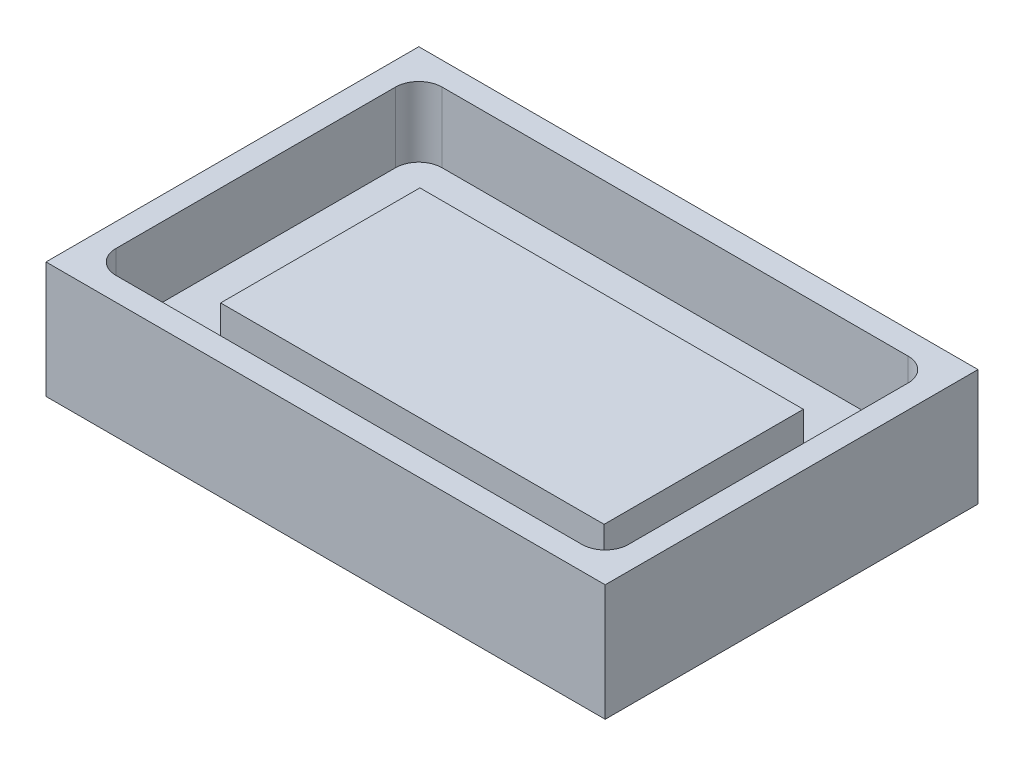
ISO-10303-21;
HEADER;
FILE_DESCRIPTION(('STEP AP214'),'2;1');
FILE_NAME('part.step','',(''),(''),'','','');
FILE_SCHEMA(('AUTOMOTIVE_DESIGN { 1 0 10303 214 1 1 1 1 }'));
ENDSEC;
DATA;
#1=APPLICATION_CONTEXT('core data for automotive mechanical design processes');
#2=APPLICATION_PROTOCOL_DEFINITION('international standard','automotive_design',2000,#1);
#3=PRODUCT_CONTEXT('',#1,'mechanical');
#4=PRODUCT('Part','Part','',(#3));
#5=PRODUCT_RELATED_PRODUCT_CATEGORY('part','',(#4));
#6=PRODUCT_DEFINITION_FORMATION('','',#4);
#7=PRODUCT_DEFINITION_CONTEXT('part definition',#1,'design');
#8=PRODUCT_DEFINITION('design','',#6,#7);
#9=PRODUCT_DEFINITION_SHAPE('','',#8);
#10=(LENGTH_UNIT() NAMED_UNIT(*) SI_UNIT(.MILLI.,.METRE.));
#11=(NAMED_UNIT(*) PLANE_ANGLE_UNIT() SI_UNIT($,.RADIAN.));
#12=(NAMED_UNIT(*) SI_UNIT($,.STERADIAN.) SOLID_ANGLE_UNIT());
#13=UNCERTAINTY_MEASURE_WITH_UNIT(LENGTH_MEASURE(1.E-05),#10,'distance_accuracy_value','');
#14=(GEOMETRIC_REPRESENTATION_CONTEXT(3) GLOBAL_UNCERTAINTY_ASSIGNED_CONTEXT((#13)) GLOBAL_UNIT_ASSIGNED_CONTEXT((#10,
#11,#12)) REPRESENTATION_CONTEXT('',''));
#15=CARTESIAN_POINT('',(0.,0.,0.));
#16=DIRECTION('',(0.,0.,1.));
#17=DIRECTION('',(1.,0.,0.));
#18=AXIS2_PLACEMENT_3D('',#15,#16,#17);
#19=CARTESIAN_POINT('',(6.35,-9.525,-44.45));
#20=DIRECTION('',(0.,-1.,0.));
#21=DIRECTION('',(0.,0.,-1.));
#22=AXIS2_PLACEMENT_3D('',#19,#20,#21);
#23=PLANE('',#22);
#24=CARTESIAN_POINT('',(6.35,-9.525,-44.45));
#25=DIRECTION('',(0.,1.,0.));
#26=DIRECTION('',(0.,0.,-1.));
#27=AXIS2_PLACEMENT_3D('',#24,#25,#26);
#28=CIRCLE('',#27,3.175);
#29=CARTESIAN_POINT('',(6.35000000000002,-9.525,-47.625));
#30=VERTEX_POINT('',#29);
#31=CARTESIAN_POINT('',(3.175,-9.525,-44.45));
#32=VERTEX_POINT('',#31);
#33=EDGE_CURVE('E174',#30,#32,#28,.T.);
#34=ORIENTED_EDGE('',*,*,#33,.T.);
#35=DIRECTION('',(0.,0.,1.));
#36=VECTOR('',#35,1.);
#37=CARTESIAN_POINT('',(3.175,-9.525,-44.45));
#38=LINE('',#37,#36);
#39=CARTESIAN_POINT('',(3.175,-9.525,-6.35000000000002));
#40=VERTEX_POINT('',#39);
#41=EDGE_CURVE('E177',#32,#40,#38,.T.);
#42=ORIENTED_EDGE('',*,*,#41,.T.);
#43=CARTESIAN_POINT('',(6.35,-9.525,-6.35));
#44=DIRECTION('',(0.,1.,0.));
#45=DIRECTION('',(0.,0.,1.));
#46=AXIS2_PLACEMENT_3D('',#43,#44,#45);
#47=CIRCLE('',#46,3.175);
#48=CARTESIAN_POINT('',(6.35000000000002,-9.525,-3.175));
#49=VERTEX_POINT('',#48);
#50=EDGE_CURVE('E181',#40,#49,#47,.T.);
#51=ORIENTED_EDGE('',*,*,#50,.T.);
#52=DIRECTION('',(1.,0.,0.));
#53=VECTOR('',#52,1.);
#54=CARTESIAN_POINT('',(6.35000000000002,-9.525,-3.175));
#55=LINE('',#54,#53);
#56=CARTESIAN_POINT('',(69.85,-9.525,-3.175));
#57=VERTEX_POINT('',#56);
#58=EDGE_CURVE('E184',#49,#57,#55,.T.);
#59=ORIENTED_EDGE('',*,*,#58,.T.);
#60=CARTESIAN_POINT('',(69.85,-9.525,-6.35));
#61=DIRECTION('',(0.,1.,0.));
#62=DIRECTION('',(0.,0.,1.));
#63=AXIS2_PLACEMENT_3D('',#60,#61,#62);
#64=CIRCLE('',#63,3.175);
#65=CARTESIAN_POINT('',(73.025,-9.525,-6.35000000000002));
#66=VERTEX_POINT('',#65);
#67=EDGE_CURVE('E187',#57,#66,#64,.T.);
#68=ORIENTED_EDGE('',*,*,#67,.T.);
#69=DIRECTION('',(0.,0.,-1.));
#70=VECTOR('',#69,1.);
#71=CARTESIAN_POINT('',(73.025,-9.525,-6.35000000000002));
#72=LINE('',#71,#70);
#73=CARTESIAN_POINT('',(73.025,-9.525,-44.45));
#74=VERTEX_POINT('',#73);
#75=EDGE_CURVE('E190',#66,#74,#72,.T.);
#76=ORIENTED_EDGE('',*,*,#75,.T.);
#77=CARTESIAN_POINT('',(69.85,-9.525,-44.45));
#78=DIRECTION('',(0.,1.,0.));
#79=DIRECTION('',(0.,0.,1.));
#80=AXIS2_PLACEMENT_3D('',#77,#78,#79);
#81=CIRCLE('',#80,3.175);
#82=CARTESIAN_POINT('',(69.85,-9.525,-47.625));
#83=VERTEX_POINT('',#82);
#84=EDGE_CURVE('E193',#74,#83,#81,.T.);
#85=ORIENTED_EDGE('',*,*,#84,.T.);
#86=DIRECTION('',(-1.,0.,0.));
#87=VECTOR('',#86,1.);
#88=CARTESIAN_POINT('',(69.85,-9.525,-47.625));
#89=LINE('',#88,#87);
#90=EDGE_CURVE('E196',#83,#30,#89,.T.);
#91=ORIENTED_EDGE('',*,*,#90,.T.);
#92=EDGE_LOOP('',(#34,#42,#51,#59,#68,#76,#85,#91));
#93=FACE_BOUND('',#92,.T.);
#94=DIRECTION('',(0.,0.,-1.));
#95=VECTOR('',#94,1.);
#96=CARTESIAN_POINT('',(64.2282091132813,-9.525,-11.8232214820229));
#97=LINE('',#96,#95);
#98=CARTESIAN_POINT('',(64.2282091132813,-9.525,-11.8232214820229));
#99=VERTEX_POINT('',#98);
#100=CARTESIAN_POINT('',(64.2282091132813,-9.525,-38.9767785179771));
#101=VERTEX_POINT('',#100);
#102=EDGE_CURVE('E165',#99,#101,#97,.T.);
#103=ORIENTED_EDGE('',*,*,#102,.F.);
#104=DIRECTION('',(1.,0.,0.));
#105=VECTOR('',#104,1.);
#106=CARTESIAN_POINT('',(11.9717908867187,-9.525,-11.8232214820229));
#107=LINE('',#106,#105);
#108=CARTESIAN_POINT('',(11.9717908867187,-9.525,-11.8232214820229));
#109=VERTEX_POINT('',#108);
#110=EDGE_CURVE('E162',#109,#99,#107,.T.);
#111=ORIENTED_EDGE('',*,*,#110,.F.);
#112=DIRECTION('',(0.,0.,1.));
#113=VECTOR('',#112,1.);
#114=CARTESIAN_POINT('',(11.9717908867187,-9.525,-11.8232214820229));
#115=LINE('',#114,#113);
#116=CARTESIAN_POINT('',(11.9717908867187,-9.525,-38.9767785179771));
#117=VERTEX_POINT('',#116);
#118=EDGE_CURVE('E53',#117,#109,#115,.T.);
#119=ORIENTED_EDGE('',*,*,#118,.F.);
#120=DIRECTION('',(-1.,0.,0.));
#121=VECTOR('',#120,1.);
#122=CARTESIAN_POINT('',(11.9717908867187,-9.525,-38.9767785179771));
#123=LINE('',#122,#121);
#124=EDGE_CURVE('E48',#101,#117,#123,.T.);
#125=ORIENTED_EDGE('',*,*,#124,.F.);
#126=EDGE_LOOP('',(#103,#111,#119,#125));
#127=FACE_BOUND('',#126,.T.);
#128=ADVANCED_FACE('F31',(#93,#127),#23,.F.);
#129=CARTESIAN_POINT('',(0.,-15.875,0.));
#130=DIRECTION('',(-1.,0.,0.));
#131=DIRECTION('',(0.,0.,1.));
#132=AXIS2_PLACEMENT_3D('',#129,#130,#131);
#133=PLANE('',#132);
#134=DIRECTION('',(0.,0.,1.));
#135=VECTOR('',#134,1.);
#136=CARTESIAN_POINT('',(0.,0.,0.));
#137=LINE('',#136,#135);
#138=CARTESIAN_POINT('',(0.,0.,-50.8));
#139=VERTEX_POINT('',#138);
#140=CARTESIAN_POINT('',(0.,0.,0.));
#141=VERTEX_POINT('',#140);
#142=EDGE_CURVE('E221',#139,#141,#137,.T.);
#143=ORIENTED_EDGE('',*,*,#142,.F.);
#144=DIRECTION('',(0.,1.,0.));
#145=VECTOR('',#144,1.);
#146=CARTESIAN_POINT('',(0.,-15.875,-50.8));
#147=LINE('',#146,#145);
#148=CARTESIAN_POINT('',(0.,-15.875,-50.8));
#149=VERTEX_POINT('',#148);
#150=EDGE_CURVE('E11',#149,#139,#147,.T.);
#151=ORIENTED_EDGE('',*,*,#150,.F.);
#152=DIRECTION('',(0.,0.,1.));
#153=VECTOR('',#152,1.);
#154=CARTESIAN_POINT('',(0.,-15.875,0.));
#155=LINE('',#154,#153);
#156=CARTESIAN_POINT('',(0.,-15.875,0.));
#157=VERTEX_POINT('',#156);
#158=EDGE_CURVE('E236',#149,#157,#155,.T.);
#159=ORIENTED_EDGE('',*,*,#158,.T.);
#160=DIRECTION('',(0.,1.,0.));
#161=VECTOR('',#160,1.);
#162=CARTESIAN_POINT('',(0.,-15.875,0.));
#163=LINE('',#162,#161);
#164=EDGE_CURVE('E35',#157,#141,#163,.T.);
#165=ORIENTED_EDGE('',*,*,#164,.T.);
#166=EDGE_LOOP('',(#143,#151,#159,#165));
#167=FACE_BOUND('',#166,.T.);
#168=ADVANCED_FACE('F33',(#167),#133,.T.);
#169=CARTESIAN_POINT('',(0.,-15.875,-50.8));
#170=DIRECTION('',(0.,0.,-1.));
#171=DIRECTION('',(-1.,0.,0.));
#172=AXIS2_PLACEMENT_3D('',#169,#170,#171);
#173=PLANE('',#172);
#174=DIRECTION('',(-1.,0.,0.));
#175=VECTOR('',#174,1.);
#176=CARTESIAN_POINT('',(0.,0.,-50.8));
#177=LINE('',#176,#175);
#178=CARTESIAN_POINT('',(76.2,0.,-50.8));
#179=VERTEX_POINT('',#178);
#180=EDGE_CURVE('E240',#179,#139,#177,.T.);
#181=ORIENTED_EDGE('',*,*,#180,.F.);
#182=DIRECTION('',(0.,1.,0.));
#183=VECTOR('',#182,1.);
#184=CARTESIAN_POINT('',(76.2,-15.875,-50.8));
#185=LINE('',#184,#183);
#186=CARTESIAN_POINT('',(76.2,-15.875,-50.8));
#187=VERTEX_POINT('',#186);
#188=EDGE_CURVE('E40',#187,#179,#185,.T.);
#189=ORIENTED_EDGE('',*,*,#188,.F.);
#190=DIRECTION('',(-1.,0.,0.));
#191=VECTOR('',#190,1.);
#192=CARTESIAN_POINT('',(0.,-15.875,-50.8));
#193=LINE('',#192,#191);
#194=EDGE_CURVE('E246',#187,#149,#193,.T.);
#195=ORIENTED_EDGE('',*,*,#194,.T.);
#196=ORIENTED_EDGE('',*,*,#150,.T.);
#197=EDGE_LOOP('',(#181,#189,#195,#196));
#198=FACE_BOUND('',#197,.T.);
#199=ADVANCED_FACE('F272',(#198),#173,.T.);
#200=CARTESIAN_POINT('',(76.2,-15.875,0.));
#201=DIRECTION('',(1.,0.,0.));
#202=DIRECTION('',(0.,0.,-1.));
#203=AXIS2_PLACEMENT_3D('',#200,#201,#202);
#204=PLANE('',#203);
#205=DIRECTION('',(0.,0.,-1.));
#206=VECTOR('',#205,1.);
#207=CARTESIAN_POINT('',(76.2,0.,0.));
#208=LINE('',#207,#206);
#209=CARTESIAN_POINT('',(76.2,0.,0.));
#210=VERTEX_POINT('',#209);
#211=EDGE_CURVE('E254',#210,#179,#208,.T.);
#212=ORIENTED_EDGE('',*,*,#211,.F.);
#213=DIRECTION('',(0.,1.,0.));
#214=VECTOR('',#213,1.);
#215=CARTESIAN_POINT('',(76.2,-15.875,0.));
#216=LINE('',#215,#214);
#217=CARTESIAN_POINT('',(76.2,-15.875,0.));
#218=VERTEX_POINT('',#217);
#219=EDGE_CURVE('E259',#218,#210,#216,.T.);
#220=ORIENTED_EDGE('',*,*,#219,.F.);
#221=DIRECTION('',(0.,0.,-1.));
#222=VECTOR('',#221,1.);
#223=CARTESIAN_POINT('',(76.2,-15.875,0.));
#224=LINE('',#223,#222);
#225=EDGE_CURVE('E243',#218,#187,#224,.T.);
#226=ORIENTED_EDGE('',*,*,#225,.T.);
#227=ORIENTED_EDGE('',*,*,#188,.T.);
#228=EDGE_LOOP('',(#212,#220,#226,#227));
#229=FACE_BOUND('',#228,.T.);
#230=ADVANCED_FACE('F278',(#229),#204,.T.);
#231=CARTESIAN_POINT('',(0.,-15.875,0.));
#232=DIRECTION('',(0.,0.,1.));
#233=DIRECTION('',(1.,0.,0.));
#234=AXIS2_PLACEMENT_3D('',#231,#232,#233);
#235=PLANE('',#234);
#236=DIRECTION('',(1.,0.,0.));
#237=VECTOR('',#236,1.);
#238=CARTESIAN_POINT('',(0.,0.,0.));
#239=LINE('',#238,#237);
#240=EDGE_CURVE('E251',#141,#210,#239,.T.);
#241=ORIENTED_EDGE('',*,*,#240,.F.);
#242=ORIENTED_EDGE('',*,*,#164,.F.);
#243=DIRECTION('',(1.,0.,0.));
#244=VECTOR('',#243,1.);
#245=CARTESIAN_POINT('',(0.,-15.875,0.));
#246=LINE('',#245,#244);
#247=EDGE_CURVE('E239',#157,#218,#246,.T.);
#248=ORIENTED_EDGE('',*,*,#247,.T.);
#249=ORIENTED_EDGE('',*,*,#219,.T.);
#250=EDGE_LOOP('',(#241,#242,#248,#249));
#251=FACE_BOUND('',#250,.T.);
#252=ADVANCED_FACE('F267',(#251),#235,.T.);
#253=CARTESIAN_POINT('',(0.,-15.875,-50.8));
#254=DIRECTION('',(0.,-1.,0.));
#255=DIRECTION('',(0.,0.,-1.));
#256=AXIS2_PLACEMENT_3D('',#253,#254,#255);
#257=PLANE('',#256);
#258=ORIENTED_EDGE('',*,*,#158,.F.);
#259=ORIENTED_EDGE('',*,*,#194,.F.);
#260=ORIENTED_EDGE('',*,*,#225,.F.);
#261=ORIENTED_EDGE('',*,*,#247,.F.);
#262=EDGE_LOOP('',(#258,#259,#260,#261));
#263=FACE_BOUND('',#262,.T.);
#264=ADVANCED_FACE('F275',(#263),#257,.T.);
#265=CARTESIAN_POINT('',(0.,0.,-50.8));
#266=DIRECTION('',(0.,-1.,0.));
#267=DIRECTION('',(0.,0.,-1.));
#268=AXIS2_PLACEMENT_3D('',#265,#266,#267);
#269=PLANE('',#268);
#270=DIRECTION('',(0.,0.,1.));
#271=VECTOR('',#270,1.);
#272=CARTESIAN_POINT('',(3.175,0.,-44.45));
#273=LINE('',#272,#271);
#274=CARTESIAN_POINT('',(3.175,0.,-44.45));
#275=VERTEX_POINT('',#274);
#276=CARTESIAN_POINT('',(3.175,0.,-6.35000000000002));
#277=VERTEX_POINT('',#276);
#278=EDGE_CURVE('E168',#275,#277,#273,.T.);
#279=ORIENTED_EDGE('',*,*,#278,.F.);
#280=CARTESIAN_POINT('',(6.35,0.,-44.45));
#281=DIRECTION('',(0.,1.,0.));
#282=DIRECTION('',(0.,0.,-1.));
#283=AXIS2_PLACEMENT_3D('',#280,#281,#282);
#284=CIRCLE('',#283,3.175);
#285=CARTESIAN_POINT('',(6.35000000000002,0.,-47.625));
#286=VERTEX_POINT('',#285);
#287=EDGE_CURVE('E166',#286,#275,#284,.T.);
#288=ORIENTED_EDGE('',*,*,#287,.F.);
#289=DIRECTION('',(-1.,0.,0.));
#290=VECTOR('',#289,1.);
#291=CARTESIAN_POINT('',(69.85,0.,-47.625));
#292=LINE('',#291,#290);
#293=CARTESIAN_POINT('',(69.85,0.,-47.625));
#294=VERTEX_POINT('',#293);
#295=EDGE_CURVE('E178',#294,#286,#292,.T.);
#296=ORIENTED_EDGE('',*,*,#295,.F.);
#297=CARTESIAN_POINT('',(69.85,0.,-44.45));
#298=DIRECTION('',(0.,1.,0.));
#299=DIRECTION('',(0.,0.,1.));
#300=AXIS2_PLACEMENT_3D('',#297,#298,#299);
#301=CIRCLE('',#300,3.175);
#302=CARTESIAN_POINT('',(73.025,0.,-44.45));
#303=VERTEX_POINT('',#302);
#304=EDGE_CURVE('E214',#303,#294,#301,.T.);
#305=ORIENTED_EDGE('',*,*,#304,.F.);
#306=DIRECTION('',(0.,0.,-1.));
#307=VECTOR('',#306,1.);
#308=CARTESIAN_POINT('',(73.025,0.,-6.35000000000002));
#309=LINE('',#308,#307);
#310=CARTESIAN_POINT('',(73.025,0.,-6.35000000000002));
#311=VERTEX_POINT('',#310);
#312=EDGE_CURVE('E211',#311,#303,#309,.T.);
#313=ORIENTED_EDGE('',*,*,#312,.F.);
#314=CARTESIAN_POINT('',(69.85,0.,-6.35));
#315=DIRECTION('',(0.,1.,0.));
#316=DIRECTION('',(0.,0.,1.));
#317=AXIS2_PLACEMENT_3D('',#314,#315,#316);
#318=CIRCLE('',#317,3.175);
#319=CARTESIAN_POINT('',(69.85,0.,-3.175));
#320=VERTEX_POINT('',#319);
#321=EDGE_CURVE('E208',#320,#311,#318,.T.);
#322=ORIENTED_EDGE('',*,*,#321,.F.);
#323=DIRECTION('',(1.,0.,0.));
#324=VECTOR('',#323,1.);
#325=CARTESIAN_POINT('',(6.35000000000002,0.,-3.175));
#326=LINE('',#325,#324);
#327=CARTESIAN_POINT('',(6.35000000000002,0.,-3.175));
#328=VERTEX_POINT('',#327);
#329=EDGE_CURVE('E205',#328,#320,#326,.T.);
#330=ORIENTED_EDGE('',*,*,#329,.F.);
#331=CARTESIAN_POINT('',(6.35,0.,-6.35));
#332=DIRECTION('',(0.,1.,0.));
#333=DIRECTION('',(0.,0.,1.));
#334=AXIS2_PLACEMENT_3D('',#331,#332,#333);
#335=CIRCLE('',#334,3.175);
#336=EDGE_CURVE('E202',#277,#328,#335,.T.);
#337=ORIENTED_EDGE('',*,*,#336,.F.);
#338=EDGE_LOOP('',(#279,#288,#296,#305,#313,#322,#330,#337));
#339=FACE_BOUND('',#338,.T.);
#340=ORIENTED_EDGE('',*,*,#142,.T.);
#341=ORIENTED_EDGE('',*,*,#240,.T.);
#342=ORIENTED_EDGE('',*,*,#211,.T.);
#343=ORIENTED_EDGE('',*,*,#180,.T.);
#344=EDGE_LOOP('',(#340,#341,#342,#343));
#345=FACE_BOUND('',#344,.T.);
#346=ADVANCED_FACE('F269',(#339,#345),#269,.F.);
#347=CARTESIAN_POINT('',(6.35,-9.525,-44.45));
#348=DIRECTION('',(0.,1.,0.));
#349=DIRECTION('',(0.,0.,1.));
#350=AXIS2_PLACEMENT_3D('',#347,#348,#349);
#351=CYLINDRICAL_SURFACE('',#350,3.175);
#352=ORIENTED_EDGE('',*,*,#287,.T.);
#353=DIRECTION('',(0.,1.,0.));
#354=VECTOR('',#353,1.);
#355=CARTESIAN_POINT('',(3.175,-9.525,-44.45));
#356=LINE('',#355,#354);
#357=EDGE_CURVE('E198',#32,#275,#356,.T.);
#358=ORIENTED_EDGE('',*,*,#357,.F.);
#359=ORIENTED_EDGE('',*,*,#33,.F.);
#360=DIRECTION('',(0.,1.,0.));
#361=VECTOR('',#360,1.);
#362=CARTESIAN_POINT('',(6.35000000000002,-9.525,-47.625));
#363=LINE('',#362,#361);
#364=EDGE_CURVE('E219',#30,#286,#363,.T.);
#365=ORIENTED_EDGE('',*,*,#364,.T.);
#366=EDGE_LOOP('',(#352,#358,#359,#365));
#367=FACE_BOUND('',#366,.T.);
#368=ADVANCED_FACE('F299',(#367),#351,.F.);
#369=CARTESIAN_POINT('',(69.85,-9.525,-47.625));
#370=DIRECTION('',(0.,0.,-1.));
#371=DIRECTION('',(-1.,0.,0.));
#372=AXIS2_PLACEMENT_3D('',#369,#370,#371);
#373=PLANE('',#372);
#374=ORIENTED_EDGE('',*,*,#295,.T.);
#375=ORIENTED_EDGE('',*,*,#364,.F.);
#376=ORIENTED_EDGE('',*,*,#90,.F.);
#377=DIRECTION('',(0.,1.,0.));
#378=VECTOR('',#377,1.);
#379=CARTESIAN_POINT('',(69.85,-9.525,-47.625));
#380=LINE('',#379,#378);
#381=EDGE_CURVE('E222',#83,#294,#380,.T.);
#382=ORIENTED_EDGE('',*,*,#381,.T.);
#383=EDGE_LOOP('',(#374,#375,#376,#382));
#384=FACE_BOUND('',#383,.T.);
#385=ADVANCED_FACE('F295',(#384),#373,.F.);
#386=CARTESIAN_POINT('',(69.85,-9.525,-44.45));
#387=DIRECTION('',(0.,1.,0.));
#388=DIRECTION('',(0.,0.,1.));
#389=AXIS2_PLACEMENT_3D('',#386,#387,#388);
#390=CYLINDRICAL_SURFACE('',#389,3.175);
#391=ORIENTED_EDGE('',*,*,#304,.T.);
#392=ORIENTED_EDGE('',*,*,#381,.F.);
#393=ORIENTED_EDGE('',*,*,#84,.F.);
#394=DIRECTION('',(0.,1.,0.));
#395=VECTOR('',#394,1.);
#396=CARTESIAN_POINT('',(73.025,-9.525,-44.45));
#397=LINE('',#396,#395);
#398=EDGE_CURVE('E224',#74,#303,#397,.T.);
#399=ORIENTED_EDGE('',*,*,#398,.T.);
#400=EDGE_LOOP('',(#391,#392,#393,#399));
#401=FACE_BOUND('',#400,.T.);
#402=ADVANCED_FACE('F298',(#401),#390,.F.);
#403=CARTESIAN_POINT('',(73.025,-9.525,-6.35000000000002));
#404=DIRECTION('',(1.,0.,0.));
#405=DIRECTION('',(0.,0.,-1.));
#406=AXIS2_PLACEMENT_3D('',#403,#404,#405);
#407=PLANE('',#406);
#408=ORIENTED_EDGE('',*,*,#312,.T.);
#409=ORIENTED_EDGE('',*,*,#398,.F.);
#410=ORIENTED_EDGE('',*,*,#75,.F.);
#411=DIRECTION('',(0.,1.,0.));
#412=VECTOR('',#411,1.);
#413=CARTESIAN_POINT('',(73.025,-9.525,-6.35000000000002));
#414=LINE('',#413,#412);
#415=EDGE_CURVE('E226',#66,#311,#414,.T.);
#416=ORIENTED_EDGE('',*,*,#415,.T.);
#417=EDGE_LOOP('',(#408,#409,#410,#416));
#418=FACE_BOUND('',#417,.T.);
#419=ADVANCED_FACE('F303',(#418),#407,.F.);
#420=CARTESIAN_POINT('',(69.85,-9.525,-6.35));
#421=DIRECTION('',(0.,1.,0.));
#422=DIRECTION('',(0.,0.,1.));
#423=AXIS2_PLACEMENT_3D('',#420,#421,#422);
#424=CYLINDRICAL_SURFACE('',#423,3.175);
#425=ORIENTED_EDGE('',*,*,#321,.T.);
#426=ORIENTED_EDGE('',*,*,#415,.F.);
#427=ORIENTED_EDGE('',*,*,#67,.F.);
#428=DIRECTION('',(0.,1.,0.));
#429=VECTOR('',#428,1.);
#430=CARTESIAN_POINT('',(69.85,-9.525,-3.175));
#431=LINE('',#430,#429);
#432=EDGE_CURVE('E228',#57,#320,#431,.T.);
#433=ORIENTED_EDGE('',*,*,#432,.T.);
#434=EDGE_LOOP('',(#425,#426,#427,#433));
#435=FACE_BOUND('',#434,.T.);
#436=ADVANCED_FACE('F307',(#435),#424,.F.);
#437=CARTESIAN_POINT('',(6.35000000000002,-9.525,-3.175));
#438=DIRECTION('',(0.,0.,1.));
#439=DIRECTION('',(1.,0.,0.));
#440=AXIS2_PLACEMENT_3D('',#437,#438,#439);
#441=PLANE('',#440);
#442=ORIENTED_EDGE('',*,*,#329,.T.);
#443=ORIENTED_EDGE('',*,*,#432,.F.);
#444=ORIENTED_EDGE('',*,*,#58,.F.);
#445=DIRECTION('',(0.,1.,0.));
#446=VECTOR('',#445,1.);
#447=CARTESIAN_POINT('',(6.35000000000002,-9.525,-3.175));
#448=LINE('',#447,#446);
#449=EDGE_CURVE('E230',#49,#328,#448,.T.);
#450=ORIENTED_EDGE('',*,*,#449,.T.);
#451=EDGE_LOOP('',(#442,#443,#444,#450));
#452=FACE_BOUND('',#451,.T.);
#453=ADVANCED_FACE('F311',(#452),#441,.F.);
#454=CARTESIAN_POINT('',(6.35,-9.525,-6.35));
#455=DIRECTION('',(0.,1.,0.));
#456=DIRECTION('',(0.,0.,1.));
#457=AXIS2_PLACEMENT_3D('',#454,#455,#456);
#458=CYLINDRICAL_SURFACE('',#457,3.175);
#459=ORIENTED_EDGE('',*,*,#336,.T.);
#460=ORIENTED_EDGE('',*,*,#449,.F.);
#461=ORIENTED_EDGE('',*,*,#50,.F.);
#462=DIRECTION('',(0.,1.,0.));
#463=VECTOR('',#462,1.);
#464=CARTESIAN_POINT('',(3.175,-9.525,-6.35000000000002));
#465=LINE('',#464,#463);
#466=EDGE_CURVE('E232',#40,#277,#465,.T.);
#467=ORIENTED_EDGE('',*,*,#466,.T.);
#468=EDGE_LOOP('',(#459,#460,#461,#467));
#469=FACE_BOUND('',#468,.T.);
#470=ADVANCED_FACE('F315',(#469),#458,.F.);
#471=CARTESIAN_POINT('',(3.175,-9.525,-44.45));
#472=DIRECTION('',(-1.,0.,0.));
#473=DIRECTION('',(0.,0.,1.));
#474=AXIS2_PLACEMENT_3D('',#471,#472,#473);
#475=PLANE('',#474);
#476=ORIENTED_EDGE('',*,*,#278,.T.);
#477=ORIENTED_EDGE('',*,*,#466,.F.);
#478=ORIENTED_EDGE('',*,*,#41,.F.);
#479=ORIENTED_EDGE('',*,*,#357,.T.);
#480=EDGE_LOOP('',(#476,#477,#478,#479));
#481=FACE_BOUND('',#480,.T.);
#482=ADVANCED_FACE('F319',(#481),#475,.F.);
#483=CARTESIAN_POINT('',(64.2282091132813,-4.7625,-11.8232214820229));
#484=DIRECTION('',(-1.,0.,0.));
#485=DIRECTION('',(0.,0.,1.));
#486=AXIS2_PLACEMENT_3D('',#483,#484,#485);
#487=PLANE('',#486);
#488=ORIENTED_EDGE('',*,*,#102,.T.);
#489=DIRECTION('',(0.,-1.,0.));
#490=VECTOR('',#489,1.);
#491=CARTESIAN_POINT('',(64.2282091132813,-4.7625,-38.9767785179771));
#492=LINE('',#491,#490);
#493=CARTESIAN_POINT('',(64.2282091132813,-4.7625,-38.9767785179771));
#494=VERTEX_POINT('',#493);
#495=EDGE_CURVE('E146',#494,#101,#492,.T.);
#496=ORIENTED_EDGE('',*,*,#495,.F.);
#497=DIRECTION('',(0.,0.,-1.));
#498=VECTOR('',#497,1.);
#499=CARTESIAN_POINT('',(64.2282091132813,-4.7625,-11.8232214820229));
#500=LINE('',#499,#498);
#501=CARTESIAN_POINT('',(64.2282091132813,-4.7625,-11.8232214820229));
#502=VERTEX_POINT('',#501);
#503=EDGE_CURVE('E153',#502,#494,#500,.T.);
#504=ORIENTED_EDGE('',*,*,#503,.F.);
#505=DIRECTION('',(0.,-1.,0.));
#506=VECTOR('',#505,1.);
#507=CARTESIAN_POINT('',(64.2282091132813,-4.7625,-11.8232214820229));
#508=LINE('',#507,#506);
#509=EDGE_CURVE('E477',#502,#99,#508,.T.);
#510=ORIENTED_EDGE('',*,*,#509,.T.);
#511=EDGE_LOOP('',(#488,#496,#504,#510));
#512=FACE_BOUND('',#511,.T.);
#513=ADVANCED_FACE('F164',(#512),#487,.F.);
#514=CARTESIAN_POINT('',(11.9717908867187,-4.7625,-38.9767785179771));
#515=DIRECTION('',(0.,0.,1.));
#516=DIRECTION('',(1.,0.,0.));
#517=AXIS2_PLACEMENT_3D('',#514,#515,#516);
#518=PLANE('',#517);
#519=ORIENTED_EDGE('',*,*,#124,.T.);
#520=DIRECTION('',(0.,-1.,0.));
#521=VECTOR('',#520,1.);
#522=CARTESIAN_POINT('',(11.9717908867187,-4.7625,-38.9767785179771));
#523=LINE('',#522,#521);
#524=CARTESIAN_POINT('',(11.9717908867187,-4.7625,-38.9767785179771));
#525=VERTEX_POINT('',#524);
#526=EDGE_CURVE('E149',#525,#117,#523,.T.);
#527=ORIENTED_EDGE('',*,*,#526,.F.);
#528=DIRECTION('',(-1.,0.,0.));
#529=VECTOR('',#528,1.);
#530=CARTESIAN_POINT('',(11.9717908867187,-4.7625,-38.9767785179771));
#531=LINE('',#530,#529);
#532=EDGE_CURVE('E142',#494,#525,#531,.T.);
#533=ORIENTED_EDGE('',*,*,#532,.F.);
#534=ORIENTED_EDGE('',*,*,#495,.T.);
#535=EDGE_LOOP('',(#519,#527,#533,#534));
#536=FACE_BOUND('',#535,.T.);
#537=ADVANCED_FACE('F144',(#536),#518,.F.);
#538=CARTESIAN_POINT('',(11.9717908867187,-4.7625,-11.8232214820229));
#539=DIRECTION('',(1.,0.,0.));
#540=DIRECTION('',(0.,0.,-1.));
#541=AXIS2_PLACEMENT_3D('',#538,#539,#540);
#542=PLANE('',#541);
#543=ORIENTED_EDGE('',*,*,#118,.T.);
#544=DIRECTION('',(0.,-1.,0.));
#545=VECTOR('',#544,1.);
#546=CARTESIAN_POINT('',(11.9717908867187,-4.7625,-11.8232214820229));
#547=LINE('',#546,#545);
#548=CARTESIAN_POINT('',(11.9717908867187,-4.7625,-11.8232214820229));
#549=VERTEX_POINT('',#548);
#550=EDGE_CURVE('E170',#549,#109,#547,.T.);
#551=ORIENTED_EDGE('',*,*,#550,.F.);
#552=DIRECTION('',(0.,0.,1.));
#553=VECTOR('',#552,1.);
#554=CARTESIAN_POINT('',(11.9717908867187,-4.7625,-11.8232214820229));
#555=LINE('',#554,#553);
#556=EDGE_CURVE('E152',#525,#549,#555,.T.);
#557=ORIENTED_EDGE('',*,*,#556,.F.);
#558=ORIENTED_EDGE('',*,*,#526,.T.);
#559=EDGE_LOOP('',(#543,#551,#557,#558));
#560=FACE_BOUND('',#559,.T.);
#561=ADVANCED_FACE('F394',(#560),#542,.F.);
#562=CARTESIAN_POINT('',(11.9717908867187,-4.7625,-11.8232214820229));
#563=DIRECTION('',(0.,0.,-1.));
#564=DIRECTION('',(-1.,0.,0.));
#565=AXIS2_PLACEMENT_3D('',#562,#563,#564);
#566=PLANE('',#565);
#567=ORIENTED_EDGE('',*,*,#110,.T.);
#568=ORIENTED_EDGE('',*,*,#509,.F.);
#569=DIRECTION('',(1.,0.,0.));
#570=VECTOR('',#569,1.);
#571=CARTESIAN_POINT('',(11.9717908867187,-4.7625,-11.8232214820229));
#572=LINE('',#571,#570);
#573=EDGE_CURVE('E158',#549,#502,#572,.T.);
#574=ORIENTED_EDGE('',*,*,#573,.F.);
#575=ORIENTED_EDGE('',*,*,#550,.T.);
#576=EDGE_LOOP('',(#567,#568,#574,#575));
#577=FACE_BOUND('',#576,.T.);
#578=ADVANCED_FACE('F400',(#577),#566,.F.);
#579=CARTESIAN_POINT('',(64.2282091132813,-4.7625,-38.9767785179771));
#580=DIRECTION('',(0.,-1.,0.));
#581=DIRECTION('',(0.,0.,-1.));
#582=AXIS2_PLACEMENT_3D('',#579,#580,#581);
#583=PLANE('',#582);
#584=ORIENTED_EDGE('',*,*,#503,.T.);
#585=ORIENTED_EDGE('',*,*,#532,.T.);
#586=ORIENTED_EDGE('',*,*,#556,.T.);
#587=ORIENTED_EDGE('',*,*,#573,.T.);
#588=EDGE_LOOP('',(#584,#585,#586,#587));
#589=FACE_BOUND('',#588,.T.);
#590=ADVANCED_FACE('F156',(#589),#583,.F.);
#591=CLOSED_SHELL('',(#128,#168,#199,#230,#252,#264,#346,#368,#385,#402,#419,#436,#453,#470,
#482,#513,#537,#561,#578,#590));
#592=MANIFOLD_SOLID_BREP('B2',#591);
#593=ADVANCED_BREP_SHAPE_REPRESENTATION('',(#18,#592),#14);
#594=SHAPE_DEFINITION_REPRESENTATION(#9,#593);
ENDSEC;
END-ISO-10303-21;
